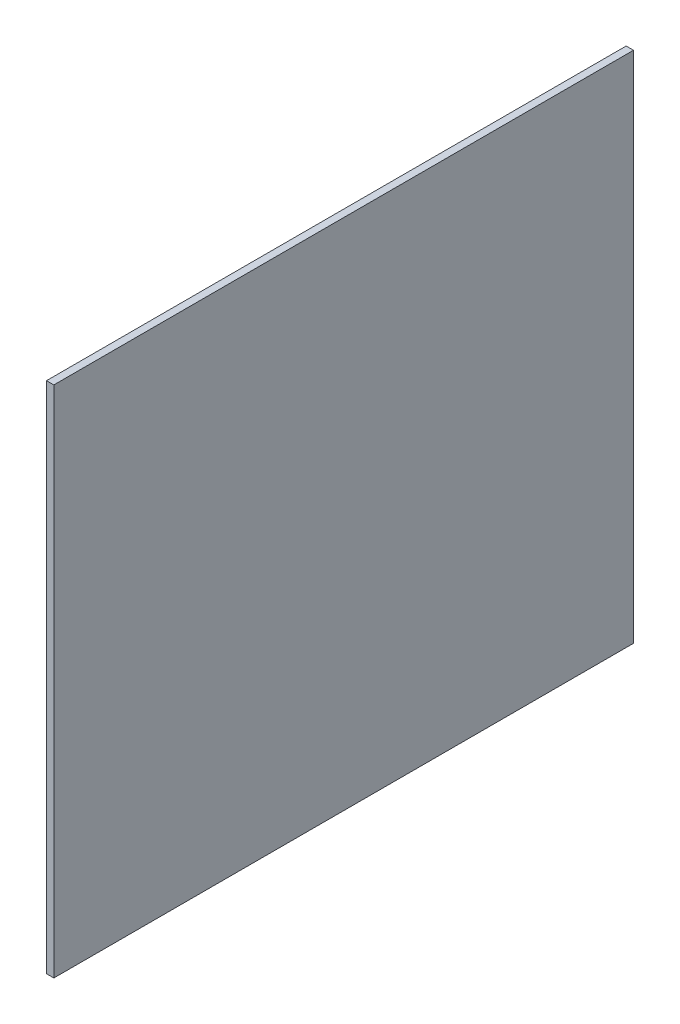
ISO-10303-21;
HEADER;
FILE_DESCRIPTION(('STEP AP214'),'2;1');
FILE_NAME('part.step','',(''),(''),'','','');
FILE_SCHEMA(('AUTOMOTIVE_DESIGN { 1 0 10303 214 1 1 1 1 }'));
ENDSEC;
DATA;
#1=APPLICATION_CONTEXT('core data for automotive mechanical design processes');
#2=APPLICATION_PROTOCOL_DEFINITION('international standard','automotive_design',2000,#1);
#3=PRODUCT_CONTEXT('',#1,'mechanical');
#4=PRODUCT('Part','Part','',(#3));
#5=PRODUCT_RELATED_PRODUCT_CATEGORY('part','',(#4));
#6=PRODUCT_DEFINITION_FORMATION('','',#4);
#7=PRODUCT_DEFINITION_CONTEXT('part definition',#1,'design');
#8=PRODUCT_DEFINITION('design','',#6,#7);
#9=PRODUCT_DEFINITION_SHAPE('','',#8);
#10=(LENGTH_UNIT() NAMED_UNIT(*) SI_UNIT(.MILLI.,.METRE.));
#11=(NAMED_UNIT(*) PLANE_ANGLE_UNIT() SI_UNIT($,.RADIAN.));
#12=(NAMED_UNIT(*) SI_UNIT($,.STERADIAN.) SOLID_ANGLE_UNIT());
#13=UNCERTAINTY_MEASURE_WITH_UNIT(LENGTH_MEASURE(1.E-05),#10,'distance_accuracy_value','');
#14=(GEOMETRIC_REPRESENTATION_CONTEXT(3) GLOBAL_UNCERTAINTY_ASSIGNED_CONTEXT((#13)) GLOBAL_UNIT_ASSIGNED_CONTEXT((#10,
#11,#12)) REPRESENTATION_CONTEXT('',''));
#15=CARTESIAN_POINT('',(0.,0.,0.));
#16=DIRECTION('',(0.,0.,1.));
#17=DIRECTION('',(1.,0.,0.));
#18=AXIS2_PLACEMENT_3D('',#15,#16,#17);
#19=CARTESIAN_POINT('',(5.,-63.8704128440367,141.330275229358));
#20=DIRECTION('',(0.,0.,-1.));
#21=DIRECTION('',(-1.,0.,0.));
#22=AXIS2_PLACEMENT_3D('',#19,#20,#21);
#23=PLANE('',#22);
#24=DIRECTION('',(0.,-1.,0.));
#25=VECTOR('',#24,1.);
#26=CARTESIAN_POINT('',(0.,-63.8704128440367,141.330275229358));
#27=LINE('',#26,#25);
#28=CARTESIAN_POINT('',(0.,286.129587155963,141.330275229358));
#29=VERTEX_POINT('',#28);
#30=CARTESIAN_POINT('',(0.,-63.8704128440367,141.330275229358));
#31=VERTEX_POINT('',#30);
#32=EDGE_CURVE('E95',#29,#31,#27,.T.);
#33=ORIENTED_EDGE('',*,*,#32,.T.);
#34=DIRECTION('',(-1.,0.,0.));
#35=VECTOR('',#34,1.);
#36=CARTESIAN_POINT('',(5.,-63.8704128440367,141.330275229358));
#37=LINE('',#36,#35);
#38=CARTESIAN_POINT('',(5.,-63.8704128440367,141.330275229358));
#39=VERTEX_POINT('',#38);
#40=EDGE_CURVE('E11',#39,#31,#37,.T.);
#41=ORIENTED_EDGE('',*,*,#40,.F.);
#42=DIRECTION('',(0.,-1.,0.));
#43=VECTOR('',#42,1.);
#44=CARTESIAN_POINT('',(5.,-63.8704128440367,141.330275229358));
#45=LINE('',#44,#43);
#46=CARTESIAN_POINT('',(5.,286.129587155963,141.330275229358));
#47=VERTEX_POINT('',#46);
#48=EDGE_CURVE('E83',#47,#39,#45,.T.);
#49=ORIENTED_EDGE('',*,*,#48,.F.);
#50=DIRECTION('',(-1.,0.,0.));
#51=VECTOR('',#50,1.);
#52=CARTESIAN_POINT('',(5.,286.129587155963,141.330275229358));
#53=LINE('',#52,#51);
#54=EDGE_CURVE('E91',#47,#29,#53,.T.);
#55=ORIENTED_EDGE('',*,*,#54,.T.);
#56=EDGE_LOOP('',(#33,#41,#49,#55));
#57=FACE_BOUND('',#56,.T.);
#58=ADVANCED_FACE('F32',(#57),#23,.F.);
#59=CARTESIAN_POINT('',(5.,-63.8704128440367,141.330275229358));
#60=DIRECTION('',(0.,1.,0.));
#61=DIRECTION('',(0.,0.,1.));
#62=AXIS2_PLACEMENT_3D('',#59,#60,#61);
#63=PLANE('',#62);
#64=DIRECTION('',(0.,0.,-1.));
#65=VECTOR('',#64,1.);
#66=CARTESIAN_POINT('',(0.,-63.8704128440367,141.330275229358));
#67=LINE('',#66,#65);
#68=CARTESIAN_POINT('',(0.,-63.8704128440367,-253.669724770642));
#69=VERTEX_POINT('',#68);
#70=EDGE_CURVE('E87',#31,#69,#67,.T.);
#71=ORIENTED_EDGE('',*,*,#70,.T.);
#72=DIRECTION('',(-1.,0.,0.));
#73=VECTOR('',#72,1.);
#74=CARTESIAN_POINT('',(5.,-63.8704128440367,-253.669724770642));
#75=LINE('',#74,#73);
#76=CARTESIAN_POINT('',(5.,-63.8704128440367,-253.669724770642));
#77=VERTEX_POINT('',#76);
#78=EDGE_CURVE('E40',#77,#69,#75,.T.);
#79=ORIENTED_EDGE('',*,*,#78,.F.);
#80=DIRECTION('',(0.,0.,-1.));
#81=VECTOR('',#80,1.);
#82=CARTESIAN_POINT('',(5.,-63.8704128440367,141.330275229358));
#83=LINE('',#82,#81);
#84=EDGE_CURVE('E78',#39,#77,#83,.T.);
#85=ORIENTED_EDGE('',*,*,#84,.F.);
#86=ORIENTED_EDGE('',*,*,#40,.T.);
#87=EDGE_LOOP('',(#71,#79,#85,#86));
#88=FACE_BOUND('',#87,.T.);
#89=ADVANCED_FACE('F86',(#88),#63,.F.);
#90=CARTESIAN_POINT('',(5.,-63.8704128440367,-253.669724770642));
#91=DIRECTION('',(0.,0.,1.));
#92=DIRECTION('',(1.,0.,0.));
#93=AXIS2_PLACEMENT_3D('',#90,#91,#92);
#94=PLANE('',#93);
#95=DIRECTION('',(0.,1.,0.));
#96=VECTOR('',#95,1.);
#97=CARTESIAN_POINT('',(0.,-63.8704128440367,-253.669724770642));
#98=LINE('',#97,#96);
#99=CARTESIAN_POINT('',(0.,286.129587155963,-253.669724770642));
#100=VERTEX_POINT('',#99);
#101=EDGE_CURVE('E65',#69,#100,#98,.T.);
#102=ORIENTED_EDGE('',*,*,#101,.T.);
#103=DIRECTION('',(-1.,0.,0.));
#104=VECTOR('',#103,1.);
#105=CARTESIAN_POINT('',(5.,286.129587155963,-253.669724770642));
#106=LINE('',#105,#104);
#107=CARTESIAN_POINT('',(5.,286.129587155963,-253.669724770642));
#108=VERTEX_POINT('',#107);
#109=EDGE_CURVE('E88',#108,#100,#106,.T.);
#110=ORIENTED_EDGE('',*,*,#109,.F.);
#111=DIRECTION('',(0.,1.,0.));
#112=VECTOR('',#111,1.);
#113=CARTESIAN_POINT('',(5.,-63.8704128440367,-253.669724770642));
#114=LINE('',#113,#112);
#115=EDGE_CURVE('E81',#77,#108,#114,.T.);
#116=ORIENTED_EDGE('',*,*,#115,.F.);
#117=ORIENTED_EDGE('',*,*,#78,.T.);
#118=EDGE_LOOP('',(#102,#110,#116,#117));
#119=FACE_BOUND('',#118,.T.);
#120=ADVANCED_FACE('F89',(#119),#94,.F.);
#121=CARTESIAN_POINT('',(5.,286.129587155963,141.330275229358));
#122=DIRECTION('',(0.,-1.,0.));
#123=DIRECTION('',(0.,0.,-1.));
#124=AXIS2_PLACEMENT_3D('',#121,#122,#123);
#125=PLANE('',#124);
#126=DIRECTION('',(0.,0.,1.));
#127=VECTOR('',#126,1.);
#128=CARTESIAN_POINT('',(0.,286.129587155963,141.330275229358));
#129=LINE('',#128,#127);
#130=EDGE_CURVE('E71',#100,#29,#129,.T.);
#131=ORIENTED_EDGE('',*,*,#130,.T.);
#132=ORIENTED_EDGE('',*,*,#54,.F.);
#133=DIRECTION('',(0.,0.,1.));
#134=VECTOR('',#133,1.);
#135=CARTESIAN_POINT('',(5.,286.129587155963,141.330275229358));
#136=LINE('',#135,#134);
#137=EDGE_CURVE('E48',#108,#47,#136,.T.);
#138=ORIENTED_EDGE('',*,*,#137,.F.);
#139=ORIENTED_EDGE('',*,*,#109,.T.);
#140=EDGE_LOOP('',(#131,#132,#138,#139));
#141=FACE_BOUND('',#140,.T.);
#142=ADVANCED_FACE('F102',(#141),#125,.F.);
#143=CARTESIAN_POINT('',(5.,0.,0.));
#144=DIRECTION('',(-1.,0.,0.));
#145=DIRECTION('',(0.,0.,1.));
#146=AXIS2_PLACEMENT_3D('',#143,#144,#145);
#147=PLANE('',#146);
#148=ORIENTED_EDGE('',*,*,#48,.T.);
#149=ORIENTED_EDGE('',*,*,#84,.T.);
#150=ORIENTED_EDGE('',*,*,#115,.T.);
#151=ORIENTED_EDGE('',*,*,#137,.T.);
#152=EDGE_LOOP('',(#148,#149,#150,#151));
#153=FACE_BOUND('',#152,.T.);
#154=ADVANCED_FACE('F79',(#153),#147,.F.);
#155=CARTESIAN_POINT('',(0.,0.,0.));
#156=DIRECTION('',(-1.,0.,0.));
#157=DIRECTION('',(0.,0.,1.));
#158=AXIS2_PLACEMENT_3D('',#155,#156,#157);
#159=PLANE('',#158);
#160=ORIENTED_EDGE('',*,*,#32,.F.);
#161=ORIENTED_EDGE('',*,*,#130,.F.);
#162=ORIENTED_EDGE('',*,*,#101,.F.);
#163=ORIENTED_EDGE('',*,*,#70,.F.);
#164=EDGE_LOOP('',(#160,#161,#162,#163));
#165=FACE_BOUND('',#164,.T.);
#166=ADVANCED_FACE('F105',(#165),#159,.T.);
#167=CLOSED_SHELL('',(#58,#89,#120,#142,#154,#166));
#168=MANIFOLD_SOLID_BREP('B2',#167);
#169=ADVANCED_BREP_SHAPE_REPRESENTATION('',(#18,#168),#14);
#170=SHAPE_DEFINITION_REPRESENTATION(#9,#169);
ENDSEC;
END-ISO-10303-21;
